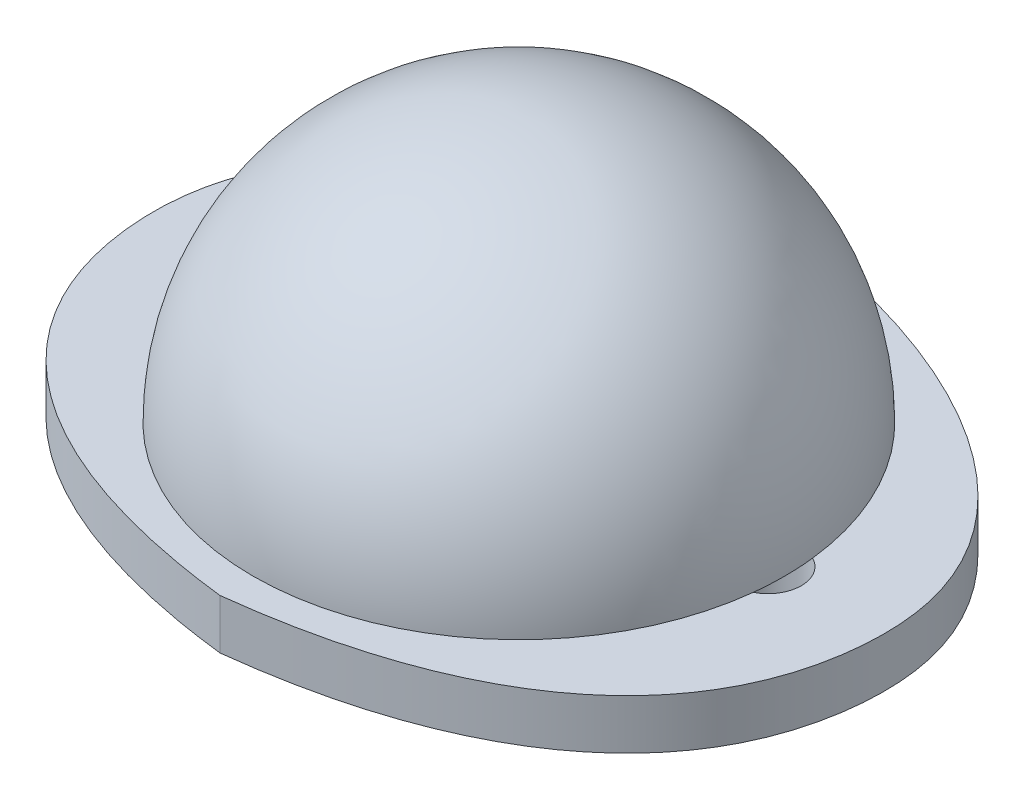
ISO-10303-21;
HEADER;
FILE_DESCRIPTION(('STEP AP214'),'2;1');
FILE_NAME('part.step','',(''),(''),'','','');
FILE_SCHEMA(('AUTOMOTIVE_DESIGN { 1 0 10303 214 1 1 1 1 }'));
ENDSEC;
DATA;
#1=APPLICATION_CONTEXT('core data for automotive mechanical design processes');
#2=APPLICATION_PROTOCOL_DEFINITION('international standard','automotive_design',2000,#1);
#3=PRODUCT_CONTEXT('',#1,'mechanical');
#4=PRODUCT('Part','Part','',(#3));
#5=PRODUCT_RELATED_PRODUCT_CATEGORY('part','',(#4));
#6=PRODUCT_DEFINITION_FORMATION('','',#4);
#7=PRODUCT_DEFINITION_CONTEXT('part definition',#1,'design');
#8=PRODUCT_DEFINITION('design','',#6,#7);
#9=PRODUCT_DEFINITION_SHAPE('','',#8);
#10=(LENGTH_UNIT() NAMED_UNIT(*) SI_UNIT(.MILLI.,.METRE.));
#11=(NAMED_UNIT(*) PLANE_ANGLE_UNIT() SI_UNIT($,.RADIAN.));
#12=(NAMED_UNIT(*) SI_UNIT($,.STERADIAN.) SOLID_ANGLE_UNIT());
#13=UNCERTAINTY_MEASURE_WITH_UNIT(LENGTH_MEASURE(1.E-05),#10,'distance_accuracy_value','');
#14=(GEOMETRIC_REPRESENTATION_CONTEXT(3) GLOBAL_UNCERTAINTY_ASSIGNED_CONTEXT((#13)) GLOBAL_UNIT_ASSIGNED_CONTEXT((#10,
#11,#12)) REPRESENTATION_CONTEXT('',''));
#15=CARTESIAN_POINT('',(0.,0.,0.));
#16=DIRECTION('',(0.,0.,1.));
#17=DIRECTION('',(1.,0.,0.));
#18=AXIS2_PLACEMENT_3D('',#15,#16,#17);
#19=CARTESIAN_POINT('',(21.990083072372,3.,0.554517839445552));
#20=DIRECTION('',(0.,1.,0.));
#21=DIRECTION('',(0.,0.,1.));
#22=AXIS2_PLACEMENT_3D('',#19,#20,#21);
#23=PLANE('',#22);
#24=CARTESIAN_POINT('',(-15.,3.,0.));
#25=DIRECTION('',(0.,-1.,0.));
#26=DIRECTION('',(0.,0.,-1.));
#27=AXIS2_PLACEMENT_3D('',#24,#25,#26);
#28=CIRCLE('',#27,2.);
#29=CARTESIAN_POINT('',(-15.9,3.,1.78605710994918));
#30=VERTEX_POINT('',#29);
#31=CARTESIAN_POINT('',(-15.9,3.,-1.78605710994918));
#32=VERTEX_POINT('',#31);
#33=EDGE_CURVE('E49',#30,#32,#28,.T.);
#34=ORIENTED_EDGE('',*,*,#33,.T.);
#35=CARTESIAN_POINT('',(0.,3.,0.));
#36=DIRECTION('',(0.,1.,0.));
#37=DIRECTION('',(0.,0.,1.));
#38=AXIS2_PLACEMENT_3D('',#35,#36,#37);
#39=CIRCLE('',#38,16.);
#40=CARTESIAN_POINT('',(15.9,3.,-1.78605710994918));
#41=VERTEX_POINT('',#40);
#42=EDGE_CURVE('E42',#41,#32,#39,.T.);
#43=ORIENTED_EDGE('',*,*,#42,.F.);
#44=CARTESIAN_POINT('',(15.,3.,0.));
#45=DIRECTION('',(0.,-1.,0.));
#46=DIRECTION('',(0.,0.,-1.));
#47=AXIS2_PLACEMENT_3D('',#44,#45,#46);
#48=CIRCLE('',#47,2.);
#49=CARTESIAN_POINT('',(15.9,3.,1.78605710994918));
#50=VERTEX_POINT('',#49);
#51=EDGE_CURVE('E56',#41,#50,#48,.T.);
#52=ORIENTED_EDGE('',*,*,#51,.T.);
#53=EDGE_CURVE('E43',#30,#50,#39,.T.);
#54=ORIENTED_EDGE('',*,*,#53,.F.);
#55=EDGE_LOOP('',(#34,#43,#52,#54));
#56=FACE_BOUND('',#55,.T.);
#57=CARTESIAN_POINT('',(0.,3.,18.));
#58=CARTESIAN_POINT('',(12.8564423818102,3.,16.5042717014835));
#59=CARTESIAN_POINT('',(21.913780718122,3.,9.8584272159414));
#60=CARTESIAN_POINT('',(22.248773714599,3.,-9.40152961210513));
#61=CARTESIAN_POINT('',(10.9820098993236,3.,-16.14589069999));
#62=CARTESIAN_POINT('',(0.,3.,-18.));
#63=B_SPLINE_CURVE_WITH_KNOTS('',3,(#57,#58,#59,#60,#61,#62),.UNSPECIFIED.,.F.,.F.,(4,1,1,4),
(0.,0.458940141239137,0.558940141239137,1.),.UNSPECIFIED.);
#64=CARTESIAN_POINT('',(0.,3.,18.));
#65=VERTEX_POINT('',#64);
#66=CARTESIAN_POINT('',(0.,3.,-18.));
#67=VERTEX_POINT('',#66);
#68=EDGE_CURVE('E107',#65,#67,#63,.T.);
#69=ORIENTED_EDGE('',*,*,#68,.T.);
#70=CARTESIAN_POINT('',(0.,3.,-18.));
#71=CARTESIAN_POINT('',(-10.9820098993236,3.,-16.14589069999));
#72=CARTESIAN_POINT('',(-22.248773714599,3.,-9.40152961210513));
#73=CARTESIAN_POINT('',(-21.913780718122,3.,9.8584272159414));
#74=CARTESIAN_POINT('',(-12.8564423818102,3.,16.5042717014835));
#75=CARTESIAN_POINT('',(0.,3.,18.));
#76=B_SPLINE_CURVE_WITH_KNOTS('',3,(#70,#71,#72,#73,#74,#75),.UNSPECIFIED.,.F.,.F.,(4,1,1,4),
(0.,0.441059858760863,0.541059858760863,1.),.UNSPECIFIED.);
#77=EDGE_CURVE('E100',#67,#65,#76,.T.);
#78=ORIENTED_EDGE('',*,*,#77,.T.);
#79=EDGE_LOOP('',(#69,#78));
#80=FACE_BOUND('',#79,.T.);
#81=ADVANCED_FACE('F33',(#56,#80),#23,.T.);
#82=CARTESIAN_POINT('',(21.990083072372,0.,0.554517839445552));
#83=DIRECTION('',(0.,1.,0.));
#84=DIRECTION('',(0.,0.,1.));
#85=AXIS2_PLACEMENT_3D('',#82,#83,#84);
#86=PLANE('',#85);
#87=CARTESIAN_POINT('',(-15.,0.,0.));
#88=DIRECTION('',(0.,-1.,0.));
#89=DIRECTION('',(0.,0.,-1.));
#90=AXIS2_PLACEMENT_3D('',#87,#88,#89);
#91=CIRCLE('',#90,2.);
#92=CARTESIAN_POINT('',(-15.,0.,-2.));
#93=VERTEX_POINT('',#92);
#94=EDGE_CURVE('E90',#93,#93,#91,.T.);
#95=ORIENTED_EDGE('',*,*,#94,.F.);
#96=EDGE_LOOP('',(#95));
#97=FACE_BOUND('',#96,.T.);
#98=CARTESIAN_POINT('',(15.,0.,0.));
#99=DIRECTION('',(0.,-1.,0.));
#100=DIRECTION('',(0.,0.,-1.));
#101=AXIS2_PLACEMENT_3D('',#98,#99,#100);
#102=CIRCLE('',#101,2.);
#103=CARTESIAN_POINT('',(15.,0.,-2.));
#104=VERTEX_POINT('',#103);
#105=EDGE_CURVE('E84',#104,#104,#102,.T.);
#106=ORIENTED_EDGE('',*,*,#105,.F.);
#107=EDGE_LOOP('',(#106));
#108=FACE_BOUND('',#107,.T.);
#109=CARTESIAN_POINT('',(0.,0.,18.));
#110=CARTESIAN_POINT('',(12.8564423818102,0.,16.5042717014835));
#111=CARTESIAN_POINT('',(21.913780718122,0.,9.8584272159414));
#112=CARTESIAN_POINT('',(22.248773714599,0.,-9.40152961210513));
#113=CARTESIAN_POINT('',(10.9820098993236,0.,-16.14589069999));
#114=CARTESIAN_POINT('',(0.,0.,-18.));
#115=B_SPLINE_CURVE_WITH_KNOTS('',3,(#109,#110,#111,#112,#113,#114),.UNSPECIFIED.,.F.,.F.,(4,1,
1,4),(0.,0.458940141239137,0.558940141239137,1.),.UNSPECIFIED.);
#116=CARTESIAN_POINT('',(0.,0.,18.));
#117=VERTEX_POINT('',#116);
#118=CARTESIAN_POINT('',(0.,0.,-18.));
#119=VERTEX_POINT('',#118);
#120=EDGE_CURVE('E108',#117,#119,#115,.T.);
#121=ORIENTED_EDGE('',*,*,#120,.F.);
#122=CARTESIAN_POINT('',(0.,0.,-18.));
#123=CARTESIAN_POINT('',(-10.9820098993236,0.,-16.14589069999));
#124=CARTESIAN_POINT('',(-22.248773714599,0.,-9.40152961210513));
#125=CARTESIAN_POINT('',(-21.913780718122,0.,9.8584272159414));
#126=CARTESIAN_POINT('',(-12.8564423818102,0.,16.5042717014835));
#127=CARTESIAN_POINT('',(0.,0.,18.));
#128=B_SPLINE_CURVE_WITH_KNOTS('',3,(#122,#123,#124,#125,#126,#127),.UNSPECIFIED.,.F.,.F.,(4,1,
1,4),(0.,0.441059858760863,0.541059858760863,1.),.UNSPECIFIED.);
#129=EDGE_CURVE('E103',#119,#117,#128,.T.);
#130=ORIENTED_EDGE('',*,*,#129,.F.);
#131=EDGE_LOOP('',(#121,#130));
#132=FACE_BOUND('',#131,.T.);
#133=CARTESIAN_POINT('',(0.,0.,0.));
#134=DIRECTION('',(0.,1.,0.));
#135=DIRECTION('',(0.,0.,1.));
#136=AXIS2_PLACEMENT_3D('',#133,#134,#135);
#137=CIRCLE('',#136,10.);
#138=CARTESIAN_POINT('',(0.,0.,10.));
#139=VERTEX_POINT('',#138);
#140=EDGE_CURVE('E115',#139,#139,#137,.T.);
#141=ORIENTED_EDGE('',*,*,#140,.T.);
#142=EDGE_LOOP('',(#141));
#143=FACE_BOUND('',#142,.T.);
#144=ADVANCED_FACE('F133',(#97,#108,#132,#143),#86,.F.);
#145=DIRECTION('',(0.,-1.,0.));
#146=VECTOR('',#145,1.);
#147=SURFACE_OF_LINEAR_EXTRUSION('',#63,#146);
#148=ORIENTED_EDGE('',*,*,#120,.T.);
#149=DIRECTION('',(0.,-1.,0.));
#150=VECTOR('',#149,1.);
#151=CARTESIAN_POINT('',(0.,3.,-18.));
#152=LINE('',#151,#150);
#153=EDGE_CURVE('E93',#67,#119,#152,.T.);
#154=ORIENTED_EDGE('',*,*,#153,.F.);
#155=ORIENTED_EDGE('',*,*,#68,.F.);
#156=DIRECTION('',(0.,-1.,0.));
#157=VECTOR('',#156,1.);
#158=CARTESIAN_POINT('',(0.,3.,18.));
#159=LINE('',#158,#157);
#160=EDGE_CURVE('E95',#65,#117,#159,.T.);
#161=ORIENTED_EDGE('',*,*,#160,.T.);
#162=EDGE_LOOP('',(#148,#154,#155,#161));
#163=FACE_BOUND('',#162,.T.);
#164=ADVANCED_FACE('F35',(#163),#147,.F.);
#165=DIRECTION('',(0.,-1.,0.));
#166=VECTOR('',#165,1.);
#167=SURFACE_OF_LINEAR_EXTRUSION('',#76,#166);
#168=ORIENTED_EDGE('',*,*,#129,.T.);
#169=ORIENTED_EDGE('',*,*,#160,.F.);
#170=ORIENTED_EDGE('',*,*,#77,.F.);
#171=ORIENTED_EDGE('',*,*,#153,.T.);
#172=EDGE_LOOP('',(#168,#169,#170,#171));
#173=FACE_BOUND('',#172,.T.);
#174=ADVANCED_FACE('F129',(#173),#167,.F.);
#175=CARTESIAN_POINT('',(0.,3.,0.));
#176=DIRECTION('',(0.,-1.,0.));
#177=DIRECTION('',(0.,0.,-1.));
#178=AXIS2_PLACEMENT_3D('',#175,#176,#177);
#179=CYLINDRICAL_SURFACE('',#178,10.);
#180=CARTESIAN_POINT('',(0.,3.,0.));
#181=DIRECTION('',(0.,-1.,0.));
#182=DIRECTION('',(1.,0.,0.));
#183=AXIS2_PLACEMENT_3D('',#180,#181,#182);
#184=CIRCLE('',#183,10.);
#185=CARTESIAN_POINT('',(10.,3.,0.));
#186=VERTEX_POINT('',#185);
#187=EDGE_CURVE('E162',#186,#186,#184,.T.);
#188=ORIENTED_EDGE('',*,*,#187,.F.);
#189=EDGE_LOOP('',(#188));
#190=FACE_BOUND('',#189,.T.);
#191=ORIENTED_EDGE('',*,*,#140,.F.);
#192=EDGE_LOOP('',(#191));
#193=FACE_BOUND('',#192,.T.);
#194=ADVANCED_FACE('F132',(#190,#193),#179,.F.);
#195=CARTESIAN_POINT('',(0.,3.,0.));
#196=DIRECTION('',(0.,-1.,0.));
#197=DIRECTION('',(1.,0.,0.));
#198=AXIS2_PLACEMENT_3D('',#195,#196,#197);
#199=PLANE('',#198);
#200=ORIENTED_EDGE('',*,*,#187,.T.);
#201=EDGE_LOOP('',(#200));
#202=FACE_BOUND('',#201,.T.);
#203=ADVANCED_FACE('F141',(#202),#199,.T.);
#204=CARTESIAN_POINT('',(0.,3.,0.));
#205=DIRECTION('',(0.,-1.,0.));
#206=DIRECTION('',(1.,0.,0.));
#207=AXIS2_PLACEMENT_3D('',#204,#205,#206);
#208=SPHERICAL_SURFACE('',#207,16.);
#209=EDGE_CURVE('E11',#50,#41,#39,.T.);
#210=ORIENTED_EDGE('',*,*,#209,.T.);
#211=ORIENTED_EDGE('',*,*,#42,.T.);
#212=EDGE_CURVE('E92',#32,#30,#39,.T.);
#213=ORIENTED_EDGE('',*,*,#212,.T.);
#214=ORIENTED_EDGE('',*,*,#53,.T.);
#215=EDGE_LOOP('',(#210,#211,#213,#214));
#216=FACE_BOUND('',#215,.T.);
#217=ADVANCED_FACE('F91',(#216),#208,.T.);
#218=CARTESIAN_POINT('',(15.,3.,0.));
#219=DIRECTION('',(0.,-1.,0.));
#220=DIRECTION('',(0.,0.,-1.));
#221=AXIS2_PLACEMENT_3D('',#218,#219,#220);
#222=CYLINDRICAL_SURFACE('',#221,2.);
#223=ORIENTED_EDGE('',*,*,#51,.F.);
#224=EDGE_CURVE('E77',#50,#41,#48,.T.);
#225=ORIENTED_EDGE('',*,*,#224,.F.);
#226=EDGE_LOOP('',(#223,#225));
#227=FACE_BOUND('',#226,.T.);
#228=ORIENTED_EDGE('',*,*,#105,.T.);
#229=EDGE_LOOP('',(#228));
#230=FACE_BOUND('',#229,.T.);
#231=ADVANCED_FACE('F82',(#227,#230),#222,.F.);
#232=CARTESIAN_POINT('',(15.,3.,0.));
#233=DIRECTION('',(0.,-1.,0.));
#234=DIRECTION('',(0.,0.,-1.));
#235=AXIS2_PLACEMENT_3D('',#232,#233,#234);
#236=PLANE('',#235);
#237=ORIENTED_EDGE('',*,*,#224,.T.);
#238=ORIENTED_EDGE('',*,*,#209,.F.);
#239=EDGE_LOOP('',(#237,#238));
#240=FACE_BOUND('',#239,.T.);
#241=ADVANCED_FACE('F76',(#240),#236,.T.);
#242=CARTESIAN_POINT('',(-15.,3.,0.));
#243=DIRECTION('',(0.,-1.,0.));
#244=DIRECTION('',(0.,0.,-1.));
#245=AXIS2_PLACEMENT_3D('',#242,#243,#244);
#246=CYLINDRICAL_SURFACE('',#245,2.);
#247=ORIENTED_EDGE('',*,*,#33,.F.);
#248=EDGE_CURVE('E160',#32,#30,#28,.T.);
#249=ORIENTED_EDGE('',*,*,#248,.F.);
#250=EDGE_LOOP('',(#247,#249));
#251=FACE_BOUND('',#250,.T.);
#252=ORIENTED_EDGE('',*,*,#94,.T.);
#253=EDGE_LOOP('',(#252));
#254=FACE_BOUND('',#253,.T.);
#255=ADVANCED_FACE('F152',(#251,#254),#246,.F.);
#256=CARTESIAN_POINT('',(-15.,3.,0.));
#257=DIRECTION('',(0.,-1.,0.));
#258=DIRECTION('',(0.,0.,-1.));
#259=AXIS2_PLACEMENT_3D('',#256,#257,#258);
#260=PLANE('',#259);
#261=ORIENTED_EDGE('',*,*,#248,.T.);
#262=ORIENTED_EDGE('',*,*,#212,.F.);
#263=EDGE_LOOP('',(#261,#262));
#264=FACE_BOUND('',#263,.T.);
#265=ADVANCED_FACE('F155',(#264),#260,.T.);
#266=CLOSED_SHELL('',(#81,#144,#164,#174,#194,#203,#217,#231,#241,#255,#265));
#267=MANIFOLD_SOLID_BREP('B2',#266);
#268=ADVANCED_BREP_SHAPE_REPRESENTATION('',(#18,#267),#14);
#269=SHAPE_DEFINITION_REPRESENTATION(#9,#268);
ENDSEC;
END-ISO-10303-21;
